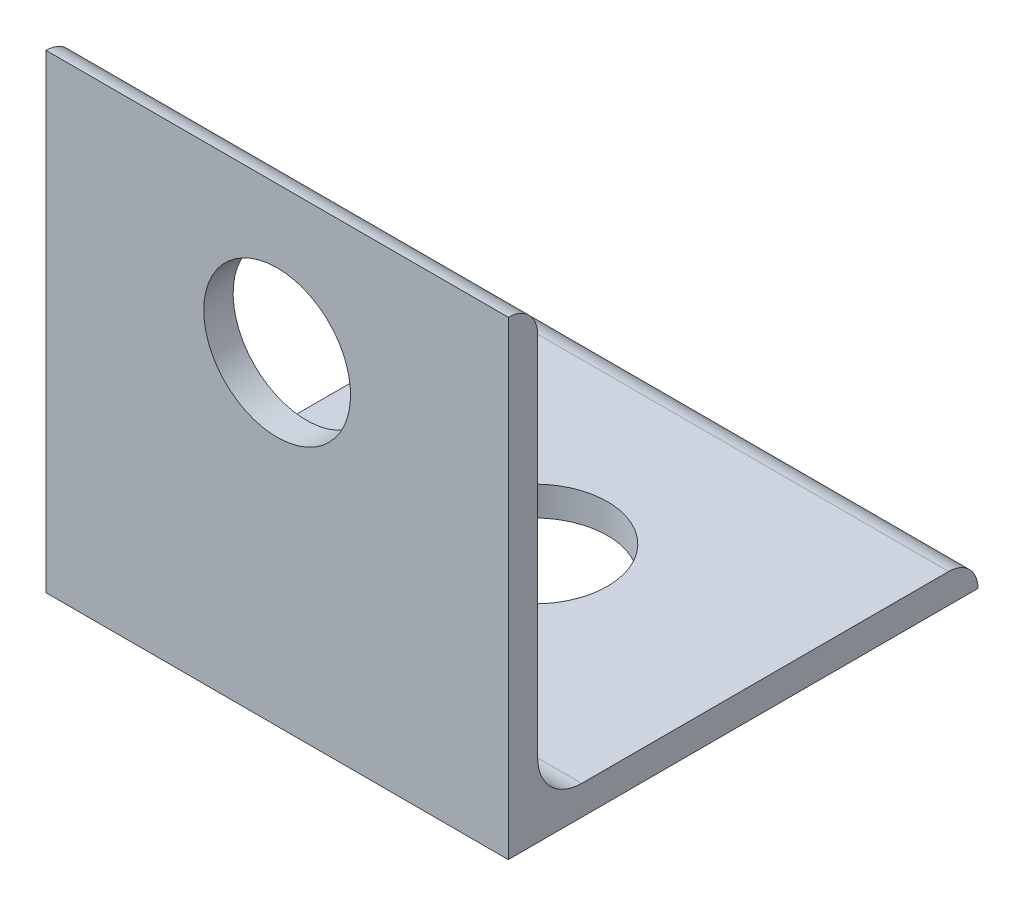
ISO-10303-21;
HEADER;
FILE_DESCRIPTION(('STEP AP214'),'2;1');
FILE_NAME('part.step','',(''),(''),'','','');
FILE_SCHEMA(('AUTOMOTIVE_DESIGN { 1 0 10303 214 1 1 1 1 }'));
ENDSEC;
DATA;
#1=APPLICATION_CONTEXT('core data for automotive mechanical design processes');
#2=APPLICATION_PROTOCOL_DEFINITION('international standard','automotive_design',2000,#1);
#3=PRODUCT_CONTEXT('',#1,'mechanical');
#4=PRODUCT('Part','Part','',(#3));
#5=PRODUCT_RELATED_PRODUCT_CATEGORY('part','',(#4));
#6=PRODUCT_DEFINITION_FORMATION('','',#4);
#7=PRODUCT_DEFINITION_CONTEXT('part definition',#1,'design');
#8=PRODUCT_DEFINITION('design','',#6,#7);
#9=PRODUCT_DEFINITION_SHAPE('','',#8);
#10=(LENGTH_UNIT() NAMED_UNIT(*) SI_UNIT(.MILLI.,.METRE.));
#11=(NAMED_UNIT(*) PLANE_ANGLE_UNIT() SI_UNIT($,.RADIAN.));
#12=(NAMED_UNIT(*) SI_UNIT($,.STERADIAN.) SOLID_ANGLE_UNIT());
#13=UNCERTAINTY_MEASURE_WITH_UNIT(LENGTH_MEASURE(1.E-05),#10,'distance_accuracy_value','');
#14=(GEOMETRIC_REPRESENTATION_CONTEXT(3) GLOBAL_UNCERTAINTY_ASSIGNED_CONTEXT((#13)) GLOBAL_UNIT_ASSIGNED_CONTEXT((#10,
#11,#12)) REPRESENTATION_CONTEXT('',''));
#15=CARTESIAN_POINT('',(0.,0.,0.));
#16=DIRECTION('',(0.,0.,1.));
#17=DIRECTION('',(1.,0.,0.));
#18=AXIS2_PLACEMENT_3D('',#15,#16,#17);
#19=CARTESIAN_POINT('',(50.,0.,-50.8));
#20=DIRECTION('',(0.,1.,0.));
#21=DIRECTION('',(0.,0.,1.));
#22=AXIS2_PLACEMENT_3D('',#19,#20,#21);
#23=PLANE('',#22);
#24=CARTESIAN_POINT('',(25.,0.,-27.78379));
#25=DIRECTION('',(0.,1.,0.));
#26=DIRECTION('',(0.,0.,1.));
#27=AXIS2_PLACEMENT_3D('',#24,#25,#26);
#28=CIRCLE('',#27,7.9375);
#29=CARTESIAN_POINT('',(25.,0.,-19.84629));
#30=VERTEX_POINT('',#29);
#31=EDGE_CURVE('E178',#30,#30,#28,.F.);
#32=ORIENTED_EDGE('',*,*,#31,.F.);
#33=EDGE_LOOP('',(#32));
#34=FACE_BOUND('',#33,.T.);
#35=DIRECTION('',(0.,0.,-1.));
#36=VECTOR('',#35,1.);
#37=CARTESIAN_POINT('',(0.,0.,-50.8));
#38=LINE('',#37,#36);
#39=CARTESIAN_POINT('',(0.,0.,0.));
#40=VERTEX_POINT('',#39);
#41=CARTESIAN_POINT('',(0.,0.,-50.8));
#42=VERTEX_POINT('',#41);
#43=EDGE_CURVE('E174',#40,#42,#38,.T.);
#44=ORIENTED_EDGE('',*,*,#43,.T.);
#45=DIRECTION('',(-1.,0.,0.));
#46=VECTOR('',#45,1.);
#47=CARTESIAN_POINT('',(50.,0.,-50.8));
#48=LINE('',#47,#46);
#49=CARTESIAN_POINT('',(50.,0.,-50.8));
#50=VERTEX_POINT('',#49);
#51=EDGE_CURVE('E13',#50,#42,#48,.T.);
#52=ORIENTED_EDGE('',*,*,#51,.F.);
#53=DIRECTION('',(0.,0.,-1.));
#54=VECTOR('',#53,1.);
#55=CARTESIAN_POINT('',(50.,0.,-50.8));
#56=LINE('',#55,#54);
#57=CARTESIAN_POINT('',(50.,0.,0.));
#58=VERTEX_POINT('',#57);
#59=EDGE_CURVE('E191',#58,#50,#56,.T.);
#60=ORIENTED_EDGE('',*,*,#59,.F.);
#61=DIRECTION('',(-1.,0.,0.));
#62=VECTOR('',#61,1.);
#63=CARTESIAN_POINT('',(50.,0.,0.));
#64=LINE('',#63,#62);
#65=EDGE_CURVE('E170',#58,#40,#64,.T.);
#66=ORIENTED_EDGE('',*,*,#65,.T.);
#67=EDGE_LOOP('',(#44,#52,#60,#66));
#68=FACE_BOUND('',#67,.T.);
#69=ADVANCED_FACE('F72',(#34,#68),#23,.F.);
#70=CARTESIAN_POINT('',(50.,0.00508,-50.8));
#71=DIRECTION('',(0.,0.,1.));
#72=DIRECTION('',(1.,0.,0.));
#73=AXIS2_PLACEMENT_3D('',#70,#71,#72);
#74=PLANE('',#73);
#75=DIRECTION('',(0.,1.,0.));
#76=VECTOR('',#75,1.);
#77=CARTESIAN_POINT('',(0.,0.00508,-50.8));
#78=LINE('',#77,#76);
#79=CARTESIAN_POINT('',(0.,0.00508,-50.8));
#80=VERTEX_POINT('',#79);
#81=EDGE_CURVE('E177',#42,#80,#78,.T.);
#82=ORIENTED_EDGE('',*,*,#81,.T.);
#83=DIRECTION('',(-1.,0.,0.));
#84=VECTOR('',#83,1.);
#85=CARTESIAN_POINT('',(50.,0.00508,-50.8));
#86=LINE('',#85,#84);
#87=CARTESIAN_POINT('',(50.,0.00508,-50.8));
#88=VERTEX_POINT('',#87);
#89=EDGE_CURVE('E80',#88,#80,#86,.T.);
#90=ORIENTED_EDGE('',*,*,#89,.F.);
#91=DIRECTION('',(0.,1.,0.));
#92=VECTOR('',#91,1.);
#93=CARTESIAN_POINT('',(50.,0.00508,-50.8));
#94=LINE('',#93,#92);
#95=EDGE_CURVE('E134',#50,#88,#94,.T.);
#96=ORIENTED_EDGE('',*,*,#95,.F.);
#97=ORIENTED_EDGE('',*,*,#51,.T.);
#98=EDGE_LOOP('',(#82,#90,#96,#97));
#99=FACE_BOUND('',#98,.T.);
#100=ADVANCED_FACE('F266',(#99),#74,.F.);
#101=CARTESIAN_POINT('',(50.,0.00507999999999961,-47.63008));
#102=DIRECTION('',(-1.,0.,0.));
#103=DIRECTION('',(0.,0.,1.));
#104=AXIS2_PLACEMENT_3D('',#101,#102,#103);
#105=CYLINDRICAL_SURFACE('',#104,3.16992);
#106=CARTESIAN_POINT('',(0.,0.00507999999999961,-47.63008));
#107=DIRECTION('',(1.,0.,0.));
#108=DIRECTION('',(0.,0.,-1.));
#109=AXIS2_PLACEMENT_3D('',#106,#107,#108);
#110=CIRCLE('',#109,3.16992);
#111=CARTESIAN_POINT('',(0.,3.175,-47.63008));
#112=VERTEX_POINT('',#111);
#113=EDGE_CURVE('E180',#80,#112,#110,.T.);
#114=ORIENTED_EDGE('',*,*,#113,.T.);
#115=DIRECTION('',(-1.,0.,0.));
#116=VECTOR('',#115,1.);
#117=CARTESIAN_POINT('',(50.,3.175,-47.63008));
#118=LINE('',#117,#116);
#119=CARTESIAN_POINT('',(50.,3.175,-47.63008));
#120=VERTEX_POINT('',#119);
#121=EDGE_CURVE('E201',#120,#112,#118,.T.);
#122=ORIENTED_EDGE('',*,*,#121,.F.);
#123=CARTESIAN_POINT('',(50.,0.00507999999999961,-47.63008));
#124=DIRECTION('',(1.,0.,0.));
#125=DIRECTION('',(0.,0.,-1.));
#126=AXIS2_PLACEMENT_3D('',#123,#124,#125);
#127=CIRCLE('',#126,3.16992);
#128=EDGE_CURVE('E209',#88,#120,#127,.T.);
#129=ORIENTED_EDGE('',*,*,#128,.F.);
#130=ORIENTED_EDGE('',*,*,#89,.T.);
#131=EDGE_LOOP('',(#114,#122,#129,#130));
#132=FACE_BOUND('',#131,.T.);
#133=ADVANCED_FACE('F207',(#132),#105,.T.);
#134=CARTESIAN_POINT('',(50.,3.17499999999999,-7.93750000000001));
#135=DIRECTION('',(0.,-1.,0.));
#136=DIRECTION('',(0.,0.,-1.));
#137=AXIS2_PLACEMENT_3D('',#134,#135,#136);
#138=PLANE('',#137);
#139=CARTESIAN_POINT('',(25.,3.17499999999999,-27.78379));
#140=DIRECTION('',(0.,1.,0.));
#141=DIRECTION('',(0.,0.,1.));
#142=AXIS2_PLACEMENT_3D('',#139,#140,#141);
#143=CIRCLE('',#142,7.9375);
#144=CARTESIAN_POINT('',(25.,3.17499999999999,-19.84629));
#145=VERTEX_POINT('',#144);
#146=EDGE_CURVE('E234',#145,#145,#143,.T.);
#147=ORIENTED_EDGE('',*,*,#146,.F.);
#148=EDGE_LOOP('',(#147));
#149=FACE_BOUND('',#148,.T.);
#150=DIRECTION('',(0.,0.,1.));
#151=VECTOR('',#150,1.);
#152=CARTESIAN_POINT('',(0.,3.17499999999999,-7.93750000000001));
#153=LINE('',#152,#151);
#154=CARTESIAN_POINT('',(0.,3.17499999999999,-7.93750000000002));
#155=VERTEX_POINT('',#154);
#156=EDGE_CURVE('E182',#112,#155,#153,.T.);
#157=ORIENTED_EDGE('',*,*,#156,.T.);
#158=DIRECTION('',(-1.,0.,0.));
#159=VECTOR('',#158,1.);
#160=CARTESIAN_POINT('',(50.,3.17499999999999,-7.93750000000002));
#161=LINE('',#160,#159);
#162=CARTESIAN_POINT('',(50.,3.17499999999999,-7.93750000000002));
#163=VERTEX_POINT('',#162);
#164=EDGE_CURVE('E198',#163,#155,#161,.T.);
#165=ORIENTED_EDGE('',*,*,#164,.F.);
#166=DIRECTION('',(0.,0.,1.));
#167=VECTOR('',#166,1.);
#168=CARTESIAN_POINT('',(50.,3.17499999999999,-7.93750000000001));
#169=LINE('',#168,#167);
#170=EDGE_CURVE('E225',#120,#163,#169,.T.);
#171=ORIENTED_EDGE('',*,*,#170,.F.);
#172=ORIENTED_EDGE('',*,*,#121,.T.);
#173=EDGE_LOOP('',(#157,#165,#171,#172));
#174=FACE_BOUND('',#173,.T.);
#175=ADVANCED_FACE('F218',(#149,#174),#138,.F.);
#176=CARTESIAN_POINT('',(50.,7.93749999999999,-7.93750000000001));
#177=DIRECTION('',(-1.,0.,0.));
#178=DIRECTION('',(0.,0.,1.));
#179=AXIS2_PLACEMENT_3D('',#176,#177,#178);
#180=CYLINDRICAL_SURFACE('',#179,4.7625);
#181=CARTESIAN_POINT('',(0.,7.93749999999999,-7.93750000000001));
#182=DIRECTION('',(-1.,0.,0.));
#183=DIRECTION('',(0.,0.,1.));
#184=AXIS2_PLACEMENT_3D('',#181,#182,#183);
#185=CIRCLE('',#184,4.7625);
#186=CARTESIAN_POINT('',(0.,7.93749999999999,-3.17500000000001));
#187=VERTEX_POINT('',#186);
#188=EDGE_CURVE('E184',#155,#187,#185,.T.);
#189=ORIENTED_EDGE('',*,*,#188,.T.);
#190=DIRECTION('',(-1.,0.,0.));
#191=VECTOR('',#190,1.);
#192=CARTESIAN_POINT('',(50.,7.93749999999999,-3.17500000000001));
#193=LINE('',#192,#191);
#194=CARTESIAN_POINT('',(50.,7.93749999999999,-3.17500000000001));
#195=VERTEX_POINT('',#194);
#196=EDGE_CURVE('E195',#195,#187,#193,.T.);
#197=ORIENTED_EDGE('',*,*,#196,.F.);
#198=CARTESIAN_POINT('',(50.,7.93749999999999,-7.93750000000001));
#199=DIRECTION('',(-1.,0.,0.));
#200=DIRECTION('',(0.,0.,1.));
#201=AXIS2_PLACEMENT_3D('',#198,#199,#200);
#202=CIRCLE('',#201,4.7625);
#203=EDGE_CURVE('E224',#163,#195,#202,.T.);
#204=ORIENTED_EDGE('',*,*,#203,.F.);
#205=ORIENTED_EDGE('',*,*,#164,.T.);
#206=EDGE_LOOP('',(#189,#197,#204,#205));
#207=FACE_BOUND('',#206,.T.);
#208=ADVANCED_FACE('F222',(#207),#180,.F.);
#209=CARTESIAN_POINT('',(50.,47.63008,-3.175));
#210=DIRECTION('',(0.,0.,1.));
#211=DIRECTION('',(0.,-1.,0.));
#212=AXIS2_PLACEMENT_3D('',#209,#210,#211);
#213=PLANE('',#212);
#214=CARTESIAN_POINT('',(25.,34.9975,-3.175));
#215=DIRECTION('',(0.,0.,-1.));
#216=DIRECTION('',(0.,1.,0.));
#217=AXIS2_PLACEMENT_3D('',#214,#215,#216);
#218=CIRCLE('',#217,7.9375);
#219=CARTESIAN_POINT('',(25.,42.935,-3.175));
#220=VERTEX_POINT('',#219);
#221=EDGE_CURVE('E240',#220,#220,#218,.T.);
#222=ORIENTED_EDGE('',*,*,#221,.F.);
#223=EDGE_LOOP('',(#222));
#224=FACE_BOUND('',#223,.T.);
#225=DIRECTION('',(0.,1.,0.));
#226=VECTOR('',#225,1.);
#227=CARTESIAN_POINT('',(0.,47.63008,-3.175));
#228=LINE('',#227,#226);
#229=CARTESIAN_POINT('',(0.,47.63008,-3.175));
#230=VERTEX_POINT('',#229);
#231=EDGE_CURVE('E186',#187,#230,#228,.T.);
#232=ORIENTED_EDGE('',*,*,#231,.T.);
#233=DIRECTION('',(-1.,0.,0.));
#234=VECTOR('',#233,1.);
#235=CARTESIAN_POINT('',(50.,47.63008,-3.175));
#236=LINE('',#235,#234);
#237=CARTESIAN_POINT('',(50.,47.63008,-3.175));
#238=VERTEX_POINT('',#237);
#239=EDGE_CURVE('E165',#238,#230,#236,.T.);
#240=ORIENTED_EDGE('',*,*,#239,.F.);
#241=DIRECTION('',(0.,1.,0.));
#242=VECTOR('',#241,1.);
#243=CARTESIAN_POINT('',(50.,47.63008,-3.175));
#244=LINE('',#243,#242);
#245=EDGE_CURVE('E156',#195,#238,#244,.T.);
#246=ORIENTED_EDGE('',*,*,#245,.F.);
#247=ORIENTED_EDGE('',*,*,#196,.T.);
#248=EDGE_LOOP('',(#232,#240,#246,#247));
#249=FACE_BOUND('',#248,.T.);
#250=ADVANCED_FACE('F246',(#224,#249),#213,.F.);
#251=CARTESIAN_POINT('',(50.,47.63008,-0.00508000000000019));
#252=DIRECTION('',(-1.,0.,0.));
#253=DIRECTION('',(0.,0.,1.));
#254=AXIS2_PLACEMENT_3D('',#251,#252,#253);
#255=CYLINDRICAL_SURFACE('',#254,3.16992);
#256=CARTESIAN_POINT('',(0.,47.63008,-0.00508000000000019));
#257=DIRECTION('',(1.,0.,0.));
#258=DIRECTION('',(0.,0.,1.));
#259=AXIS2_PLACEMENT_3D('',#256,#257,#258);
#260=CIRCLE('',#259,3.16992);
#261=CARTESIAN_POINT('',(0.,50.8,-0.00508));
#262=VERTEX_POINT('',#261);
#263=EDGE_CURVE('E164',#230,#262,#260,.T.);
#264=ORIENTED_EDGE('',*,*,#263,.T.);
#265=DIRECTION('',(-1.,0.,0.));
#266=VECTOR('',#265,1.);
#267=CARTESIAN_POINT('',(50.,50.8,-0.00508));
#268=LINE('',#267,#266);
#269=CARTESIAN_POINT('',(50.,50.8,-0.00508));
#270=VERTEX_POINT('',#269);
#271=EDGE_CURVE('E161',#270,#262,#268,.T.);
#272=ORIENTED_EDGE('',*,*,#271,.F.);
#273=CARTESIAN_POINT('',(50.,47.63008,-0.00508000000000019));
#274=DIRECTION('',(1.,0.,0.));
#275=DIRECTION('',(0.,0.,1.));
#276=AXIS2_PLACEMENT_3D('',#273,#274,#275);
#277=CIRCLE('',#276,3.16992);
#278=EDGE_CURVE('E150',#238,#270,#277,.T.);
#279=ORIENTED_EDGE('',*,*,#278,.F.);
#280=ORIENTED_EDGE('',*,*,#239,.T.);
#281=EDGE_LOOP('',(#264,#272,#279,#280));
#282=FACE_BOUND('',#281,.T.);
#283=ADVANCED_FACE('F162',(#282),#255,.T.);
#284=CARTESIAN_POINT('',(50.,50.8,0.));
#285=DIRECTION('',(0.,-1.,0.));
#286=DIRECTION('',(0.,0.,-1.));
#287=AXIS2_PLACEMENT_3D('',#284,#285,#286);
#288=PLANE('',#287);
#289=DIRECTION('',(0.,0.,1.));
#290=VECTOR('',#289,1.);
#291=CARTESIAN_POINT('',(0.,50.8,0.));
#292=LINE('',#291,#290);
#293=CARTESIAN_POINT('',(0.,50.8,0.));
#294=VERTEX_POINT('',#293);
#295=EDGE_CURVE('E120',#262,#294,#292,.T.);
#296=ORIENTED_EDGE('',*,*,#295,.T.);
#297=DIRECTION('',(-1.,0.,0.));
#298=VECTOR('',#297,1.);
#299=CARTESIAN_POINT('',(50.,50.8,0.));
#300=LINE('',#299,#298);
#301=CARTESIAN_POINT('',(50.,50.8,0.));
#302=VERTEX_POINT('',#301);
#303=EDGE_CURVE('E166',#302,#294,#300,.T.);
#304=ORIENTED_EDGE('',*,*,#303,.F.);
#305=DIRECTION('',(0.,0.,1.));
#306=VECTOR('',#305,1.);
#307=CARTESIAN_POINT('',(50.,50.8,0.));
#308=LINE('',#307,#306);
#309=EDGE_CURVE('E154',#270,#302,#308,.T.);
#310=ORIENTED_EDGE('',*,*,#309,.F.);
#311=ORIENTED_EDGE('',*,*,#271,.T.);
#312=EDGE_LOOP('',(#296,#304,#310,#311));
#313=FACE_BOUND('',#312,.T.);
#314=ADVANCED_FACE('F168',(#313),#288,.F.);
#315=CARTESIAN_POINT('',(50.,0.,0.));
#316=DIRECTION('',(0.,0.,-1.));
#317=DIRECTION('',(-1.,0.,0.));
#318=AXIS2_PLACEMENT_3D('',#315,#316,#317);
#319=PLANE('',#318);
#320=CARTESIAN_POINT('',(25.,34.9975,0.));
#321=DIRECTION('',(0.,0.,-1.));
#322=DIRECTION('',(-1.,0.,0.));
#323=AXIS2_PLACEMENT_3D('',#320,#321,#322);
#324=CIRCLE('',#323,7.9375);
#325=CARTESIAN_POINT('',(17.0625,34.9975,0.));
#326=VERTEX_POINT('',#325);
#327=EDGE_CURVE('E237',#326,#326,#324,.F.);
#328=ORIENTED_EDGE('',*,*,#327,.F.);
#329=EDGE_LOOP('',(#328));
#330=FACE_BOUND('',#329,.T.);
#331=DIRECTION('',(0.,-1.,0.));
#332=VECTOR('',#331,1.);
#333=CARTESIAN_POINT('',(0.,0.,0.));
#334=LINE('',#333,#332);
#335=EDGE_CURVE('E126',#294,#40,#334,.T.);
#336=ORIENTED_EDGE('',*,*,#335,.T.);
#337=ORIENTED_EDGE('',*,*,#65,.F.);
#338=DIRECTION('',(0.,-1.,0.));
#339=VECTOR('',#338,1.);
#340=CARTESIAN_POINT('',(50.,0.,0.));
#341=LINE('',#340,#339);
#342=EDGE_CURVE('E88',#302,#58,#341,.T.);
#343=ORIENTED_EDGE('',*,*,#342,.F.);
#344=ORIENTED_EDGE('',*,*,#303,.T.);
#345=EDGE_LOOP('',(#336,#337,#343,#344));
#346=FACE_BOUND('',#345,.T.);
#347=ADVANCED_FACE('F253',(#330,#346),#319,.F.);
#348=CARTESIAN_POINT('',(50.,47.63008,-0.00508000000000019));
#349=DIRECTION('',(-1.,0.,0.));
#350=DIRECTION('',(0.,0.,1.));
#351=AXIS2_PLACEMENT_3D('',#348,#349,#350);
#352=PLANE('',#351);
#353=ORIENTED_EDGE('',*,*,#59,.T.);
#354=ORIENTED_EDGE('',*,*,#95,.T.);
#355=ORIENTED_EDGE('',*,*,#128,.T.);
#356=ORIENTED_EDGE('',*,*,#170,.T.);
#357=ORIENTED_EDGE('',*,*,#203,.T.);
#358=ORIENTED_EDGE('',*,*,#245,.T.);
#359=ORIENTED_EDGE('',*,*,#278,.T.);
#360=ORIENTED_EDGE('',*,*,#309,.T.);
#361=ORIENTED_EDGE('',*,*,#342,.T.);
#362=EDGE_LOOP('',(#353,#354,#355,#356,#357,#358,#359,#360,#361));
#363=FACE_BOUND('',#362,.T.);
#364=ADVANCED_FACE('F152',(#363),#352,.F.);
#365=CARTESIAN_POINT('',(0.,47.63008,-0.00508000000000019));
#366=DIRECTION('',(-1.,0.,0.));
#367=DIRECTION('',(0.,0.,1.));
#368=AXIS2_PLACEMENT_3D('',#365,#366,#367);
#369=PLANE('',#368);
#370=ORIENTED_EDGE('',*,*,#43,.F.);
#371=ORIENTED_EDGE('',*,*,#335,.F.);
#372=ORIENTED_EDGE('',*,*,#295,.F.);
#373=ORIENTED_EDGE('',*,*,#263,.F.);
#374=ORIENTED_EDGE('',*,*,#231,.F.);
#375=ORIENTED_EDGE('',*,*,#188,.F.);
#376=ORIENTED_EDGE('',*,*,#156,.F.);
#377=ORIENTED_EDGE('',*,*,#113,.F.);
#378=ORIENTED_EDGE('',*,*,#81,.F.);
#379=EDGE_LOOP('',(#370,#371,#372,#373,#374,#375,#376,#377,#378));
#380=FACE_BOUND('',#379,.T.);
#381=ADVANCED_FACE('F213',(#380),#369,.T.);
#382=CARTESIAN_POINT('',(25.,-22.4506403026729,-27.78379));
#383=DIRECTION('',(0.,1.,0.));
#384=DIRECTION('',(0.,0.,1.));
#385=AXIS2_PLACEMENT_3D('',#382,#383,#384);
#386=CYLINDRICAL_SURFACE('',#385,7.9375);
#387=ORIENTED_EDGE('',*,*,#31,.T.);
#388=EDGE_LOOP('',(#387));
#389=FACE_BOUND('',#388,.T.);
#390=ORIENTED_EDGE('',*,*,#146,.T.);
#391=EDGE_LOOP('',(#390));
#392=FACE_BOUND('',#391,.T.);
#393=ADVANCED_FACE('F273',(#389,#392),#386,.F.);
#394=CARTESIAN_POINT('',(25.,34.9975,22.4506403026729));
#395=DIRECTION('',(0.,0.,-1.));
#396=DIRECTION('',(0.,1.,0.));
#397=AXIS2_PLACEMENT_3D('',#394,#395,#396);
#398=CYLINDRICAL_SURFACE('',#397,7.9375);
#399=ORIENTED_EDGE('',*,*,#327,.T.);
#400=EDGE_LOOP('',(#399));
#401=FACE_BOUND('',#400,.T.);
#402=ORIENTED_EDGE('',*,*,#221,.T.);
#403=EDGE_LOOP('',(#402));
#404=FACE_BOUND('',#403,.T.);
#405=ADVANCED_FACE('F244',(#401,#404),#398,.F.);
#406=CLOSED_SHELL('',(#69,#100,#133,#175,#208,#250,#283,#314,#347,#364,#381,#393,#405));
#407=MANIFOLD_SOLID_BREP('B2',#406);
#408=ADVANCED_BREP_SHAPE_REPRESENTATION('',(#18,#407),#14);
#409=SHAPE_DEFINITION_REPRESENTATION(#9,#408);
ENDSEC;
END-ISO-10303-21;
